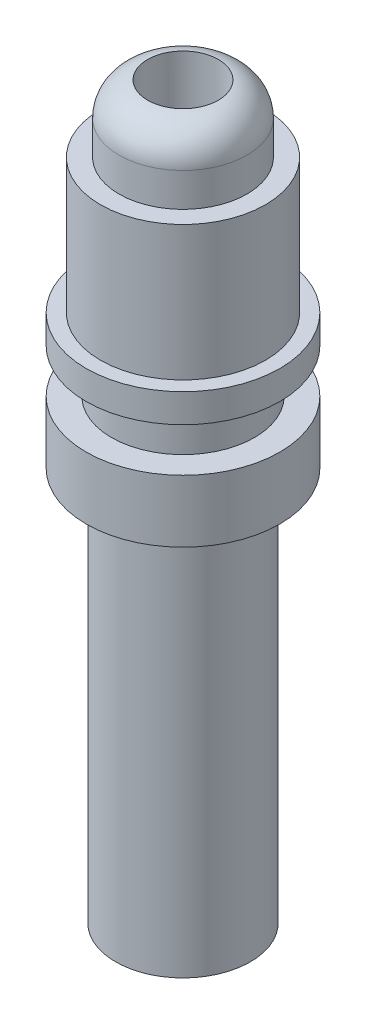
ISO-10303-21;
HEADER;
FILE_DESCRIPTION(('STEP AP214'),'2;1');
FILE_NAME('part.step','',(''),(''),'','','');
FILE_SCHEMA(('AUTOMOTIVE_DESIGN { 1 0 10303 214 1 1 1 1 }'));
ENDSEC;
DATA;
#1=APPLICATION_CONTEXT('core data for automotive mechanical design processes');
#2=APPLICATION_PROTOCOL_DEFINITION('international standard','automotive_design',2000,#1);
#3=PRODUCT_CONTEXT('',#1,'mechanical');
#4=PRODUCT('Part','Part','',(#3));
#5=PRODUCT_RELATED_PRODUCT_CATEGORY('part','',(#4));
#6=PRODUCT_DEFINITION_FORMATION('','',#4);
#7=PRODUCT_DEFINITION_CONTEXT('part definition',#1,'design');
#8=PRODUCT_DEFINITION('design','',#6,#7);
#9=PRODUCT_DEFINITION_SHAPE('','',#8);
#10=(LENGTH_UNIT() NAMED_UNIT(*) SI_UNIT(.MILLI.,.METRE.));
#11=(NAMED_UNIT(*) PLANE_ANGLE_UNIT() SI_UNIT($,.RADIAN.));
#12=(NAMED_UNIT(*) SI_UNIT($,.STERADIAN.) SOLID_ANGLE_UNIT());
#13=UNCERTAINTY_MEASURE_WITH_UNIT(LENGTH_MEASURE(1.E-05),#10,'distance_accuracy_value','');
#14=(GEOMETRIC_REPRESENTATION_CONTEXT(3) GLOBAL_UNCERTAINTY_ASSIGNED_CONTEXT((#13)) GLOBAL_UNIT_ASSIGNED_CONTEXT((#10,
#11,#12)) REPRESENTATION_CONTEXT('',''));
#15=CARTESIAN_POINT('',(0.,0.,0.));
#16=DIRECTION('',(0.,0.,1.));
#17=DIRECTION('',(1.,0.,0.));
#18=AXIS2_PLACEMENT_3D('',#15,#16,#17);
#19=CARTESIAN_POINT('',(0.,20.001,0.));
#20=DIRECTION('',(0.,-1.,0.));
#21=DIRECTION('',(0.,0.,-1.));
#22=AXIS2_PLACEMENT_3D('',#19,#20,#21);
#23=CYLINDRICAL_SURFACE('',#22,1.25);
#24=CARTESIAN_POINT('',(0.,-23.4,0.));
#25=DIRECTION('',(0.,-1.,0.));
#26=DIRECTION('',(0.,0.,-1.));
#27=AXIS2_PLACEMENT_3D('',#24,#25,#26);
#28=CIRCLE('',#27,1.25);
#29=CARTESIAN_POINT('',(0.,-23.4,-1.25));
#30=VERTEX_POINT('',#29);
#31=EDGE_CURVE('E70',#30,#30,#28,.T.);
#32=CARTESIAN_POINT('',(0.,8.,0.));
#33=DIRECTION('',(0.,1.,0.));
#34=DIRECTION('',(0.,0.,1.));
#35=AXIS2_PLACEMENT_3D('',#32,#33,#34);
#36=CIRCLE('',#35,1.25);
#37=CARTESIAN_POINT('',(0.,8.,-1.25));
#38=VERTEX_POINT('',#37);
#39=EDGE_CURVE('E64',#38,#38,#36,.F.);
#40=CARTESIAN_POINT('',(0.,-23.4,-1.25));
#41=CARTESIAN_POINT('',(0.,-23.0729166666667,-1.25));
#42=CARTESIAN_POINT('',(0.,-22.7458333333333,-1.25));
#43=CARTESIAN_POINT('',(0.,-22.0916666666667,-1.25));
#44=CARTESIAN_POINT('',(0.,-21.7645833333333,-1.25));
#45=CARTESIAN_POINT('',(0.,-21.1104166666667,-1.25));
#46=CARTESIAN_POINT('',(0.,-20.7833333333333,-1.25));
#47=CARTESIAN_POINT('',(0.,-20.1291666666667,-1.25));
#48=CARTESIAN_POINT('',(0.,-19.8020833333333,-1.25));
#49=CARTESIAN_POINT('',(0.,-19.1479166666667,-1.25));
#50=CARTESIAN_POINT('',(0.,-18.8208333333333,-1.25));
#51=CARTESIAN_POINT('',(0.,-18.1666666666667,-1.25));
#52=CARTESIAN_POINT('',(0.,-17.8395833333333,-1.25));
#53=CARTESIAN_POINT('',(0.,-17.1854166666667,-1.25));
#54=CARTESIAN_POINT('',(0.,-16.8583333333333,-1.25));
#55=CARTESIAN_POINT('',(0.,-16.2041666666667,-1.25));
#56=CARTESIAN_POINT('',(0.,-15.8770833333333,-1.25));
#57=CARTESIAN_POINT('',(0.,-15.2229166666667,-1.25));
#58=CARTESIAN_POINT('',(0.,-14.8958333333333,-1.25));
#59=CARTESIAN_POINT('',(0.,-14.2416666666667,-1.25));
#60=CARTESIAN_POINT('',(0.,-13.9145833333333,-1.25));
#61=CARTESIAN_POINT('',(0.,-13.2604166666667,-1.25));
#62=CARTESIAN_POINT('',(0.,-12.9333333333333,-1.25));
#63=CARTESIAN_POINT('',(0.,-12.2791666666667,-1.25));
#64=CARTESIAN_POINT('',(0.,-11.9520833333333,-1.25));
#65=CARTESIAN_POINT('',(0.,-11.2979166666667,-1.25));
#66=CARTESIAN_POINT('',(0.,-10.9708333333333,-1.25));
#67=CARTESIAN_POINT('',(0.,-10.3166666666667,-1.25));
#68=CARTESIAN_POINT('',(0.,-9.98958333333334,-1.25));
#69=CARTESIAN_POINT('',(0.,-9.33541666666667,-1.25));
#70=CARTESIAN_POINT('',(0.,-9.00833333333333,-1.25));
#71=CARTESIAN_POINT('',(0.,-8.35416666666667,-1.25));
#72=CARTESIAN_POINT('',(0.,-8.02708333333334,-1.25));
#73=CARTESIAN_POINT('',(0.,-7.37291666666667,-1.25));
#74=CARTESIAN_POINT('',(0.,-7.04583333333334,-1.25));
#75=CARTESIAN_POINT('',(0.,-6.39166666666667,-1.25));
#76=CARTESIAN_POINT('',(0.,-6.06458333333334,-1.25));
#77=CARTESIAN_POINT('',(0.,-5.41041666666667,-1.25));
#78=CARTESIAN_POINT('',(0.,-5.08333333333333,-1.25));
#79=CARTESIAN_POINT('',(0.,-4.42916666666667,-1.25));
#80=CARTESIAN_POINT('',(0.,-4.10208333333333,-1.25));
#81=CARTESIAN_POINT('',(0.,-3.44791666666667,-1.25));
#82=CARTESIAN_POINT('',(0.,-3.12083333333333,-1.25));
#83=CARTESIAN_POINT('',(0.,-2.46666666666667,-1.25));
#84=CARTESIAN_POINT('',(0.,-2.13958333333333,-1.25));
#85=CARTESIAN_POINT('',(0.,-1.48541666666667,-1.25));
#86=CARTESIAN_POINT('',(0.,-1.15833333333334,-1.25));
#87=CARTESIAN_POINT('',(0.,-0.504166666666669,-1.25));
#88=CARTESIAN_POINT('',(0.,-0.177083333333336,-1.25));
#89=CARTESIAN_POINT('',(0.,0.477083333333332,-1.25));
#90=CARTESIAN_POINT('',(0.,0.804166666666666,-1.25));
#91=CARTESIAN_POINT('',(0.,1.45833333333333,-1.25));
#92=CARTESIAN_POINT('',(0.,1.78541666666667,-1.25));
#93=CARTESIAN_POINT('',(0.,2.43958333333333,-1.25));
#94=CARTESIAN_POINT('',(0.,2.76666666666667,-1.25));
#95=CARTESIAN_POINT('',(0.,3.42083333333333,-1.25));
#96=CARTESIAN_POINT('',(0.,3.74791666666667,-1.25));
#97=CARTESIAN_POINT('',(0.,4.40208333333333,-1.25));
#98=CARTESIAN_POINT('',(0.,4.72916666666666,-1.25));
#99=CARTESIAN_POINT('',(0.,5.38333333333333,-1.25));
#100=CARTESIAN_POINT('',(0.,5.71041666666666,-1.25));
#101=CARTESIAN_POINT('',(0.,6.36458333333333,-1.25));
#102=CARTESIAN_POINT('',(0.,6.69166666666667,-1.25));
#103=CARTESIAN_POINT('',(0.,7.34583333333333,-1.25));
#104=CARTESIAN_POINT('',(0.,7.67291666666666,-1.25));
#105=CARTESIAN_POINT('',(0.,8.,-1.25));
#106=B_SPLINE_CURVE_WITH_KNOTS('',3,(#40,#41,#42,#43,#44,#45,#46,#47,#48,#49,#50,#51,#52,#53,
#54,#55,#56,#57,#58,#59,#60,#61,#62,#63,#64,#65,#66,#67,#68,#69,#70,#71,#72,#73,#74,#75,#76,#77,
#78,#79,#80,#81,#82,#83,#84,#85,#86,#87,#88,#89,#90,#91,#92,#93,#94,#95,#96,#97,#98,#99,#100,
#101,#102,#103,#104,#105),.UNSPECIFIED.,.F.,.F.,(4,2,2,2,2,2,2,2,2,2,2,2,2,2,2,2,2,2,2,2,2,2,2,
2,2,2,2,2,2,2,2,2,4),(0.,0.981250000000003,1.9625,2.94375,3.925,4.90625,5.8875,6.86875,7.85,
8.83125,9.8125,10.79375,11.775,12.75625,13.7375,14.71875,15.7,16.68125,17.6625,18.64375,19.625,
20.60625,21.5875,22.56875,23.55,24.53125,25.5125,26.49375,27.475,28.45625,29.4375,30.41875,
31.4),.UNSPECIFIED.);
#107=EDGE_CURVE('BSEAM32',#30,#38,#106,.T.);
#108=ORIENTED_EDGE('',*,*,#31,.T.);
#109=ORIENTED_EDGE('',*,*,#39,.F.);
#110=ORIENTED_EDGE('',*,*,#107,.T.);
#111=ORIENTED_EDGE('',*,*,#107,.F.);
#112=EDGE_LOOP('',(#108,#110,#109,#111));
#113=FACE_BOUND('',#112,.T.);
#114=ADVANCED_FACE('F32',(#113),#23,.F.);
#115=CARTESIAN_POINT('',(0.,16.,0.));
#116=DIRECTION('',(0.,-1.,0.));
#117=DIRECTION('',(0.,0.,-1.));
#118=AXIS2_PLACEMENT_3D('',#115,#116,#117);
#119=CYLINDRICAL_SURFACE('',#118,5.75);
#120=CARTESIAN_POINT('',(0.,6.3,0.));
#121=DIRECTION('',(0.,1.,0.));
#122=DIRECTION('',(0.,0.,1.));
#123=AXIS2_PLACEMENT_3D('',#120,#121,#122);
#124=CIRCLE('',#123,5.75);
#125=CARTESIAN_POINT('',(0.,6.3,5.75));
#126=VERTEX_POINT('',#125);
#127=EDGE_CURVE('E86',#126,#126,#124,.T.);
#128=ORIENTED_EDGE('',*,*,#127,.T.);
#129=EDGE_LOOP('',(#128));
#130=FACE_BOUND('',#129,.T.);
#131=CARTESIAN_POINT('',(0.,8.,0.));
#132=DIRECTION('',(0.,1.,0.));
#133=DIRECTION('',(0.,0.,1.));
#134=AXIS2_PLACEMENT_3D('',#131,#132,#133);
#135=CIRCLE('',#134,5.75);
#136=CARTESIAN_POINT('',(0.,8.,5.75));
#137=VERTEX_POINT('',#136);
#138=EDGE_CURVE('E57',#137,#137,#135,.T.);
#139=ORIENTED_EDGE('',*,*,#138,.F.);
#140=EDGE_LOOP('',(#139));
#141=FACE_BOUND('',#140,.T.);
#142=ADVANCED_FACE('F111',(#130,#141),#119,.T.);
#143=CARTESIAN_POINT('',(0.,8.,0.));
#144=DIRECTION('',(0.,1.,0.));
#145=DIRECTION('',(0.,0.,1.));
#146=AXIS2_PLACEMENT_3D('',#143,#144,#145);
#147=PLANE('',#146);
#148=CARTESIAN_POINT('',(0.,8.,0.));
#149=DIRECTION('',(0.,1.,0.));
#150=DIRECTION('',(0.,0.,1.));
#151=AXIS2_PLACEMENT_3D('',#148,#149,#150);
#152=CIRCLE('',#151,4.9);
#153=CARTESIAN_POINT('',(0.,8.,4.9));
#154=VERTEX_POINT('',#153);
#155=EDGE_CURVE('E54',#154,#154,#152,.T.);
#156=ORIENTED_EDGE('',*,*,#155,.F.);
#157=EDGE_LOOP('',(#156));
#158=FACE_BOUND('',#157,.T.);
#159=ORIENTED_EDGE('',*,*,#138,.T.);
#160=EDGE_LOOP('',(#159));
#161=FACE_BOUND('',#160,.T.);
#162=ADVANCED_FACE('F117',(#158,#161),#147,.T.);
#163=CARTESIAN_POINT('',(0.,8.,0.));
#164=DIRECTION('',(0.,1.,0.));
#165=DIRECTION('',(0.,0.,1.));
#166=AXIS2_PLACEMENT_3D('',#163,#164,#165);
#167=CYLINDRICAL_SURFACE('',#166,4.9);
#168=ORIENTED_EDGE('',*,*,#155,.T.);
#169=EDGE_LOOP('',(#168));
#170=FACE_BOUND('',#169,.T.);
#171=CARTESIAN_POINT('',(0.,16.,0.));
#172=DIRECTION('',(0.,1.,0.));
#173=DIRECTION('',(0.,0.,1.));
#174=AXIS2_PLACEMENT_3D('',#171,#172,#173);
#175=CIRCLE('',#174,4.9);
#176=CARTESIAN_POINT('',(0.,16.,4.9));
#177=VERTEX_POINT('',#176);
#178=EDGE_CURVE('E58',#177,#177,#175,.T.);
#179=ORIENTED_EDGE('',*,*,#178,.F.);
#180=EDGE_LOOP('',(#179));
#181=FACE_BOUND('',#180,.T.);
#182=ADVANCED_FACE('F157',(#170,#181),#167,.T.);
#183=CARTESIAN_POINT('',(0.,16.,0.));
#184=DIRECTION('',(0.,1.,0.));
#185=DIRECTION('',(0.,0.,1.));
#186=AXIS2_PLACEMENT_3D('',#183,#184,#185);
#187=PLANE('',#186);
#188=CARTESIAN_POINT('',(0.,16.,0.));
#189=DIRECTION('',(0.,1.,0.));
#190=DIRECTION('',(0.,0.,1.));
#191=AXIS2_PLACEMENT_3D('',#188,#189,#190);
#192=CIRCLE('',#191,3.8);
#193=CARTESIAN_POINT('',(0.,16.,3.8));
#194=VERTEX_POINT('',#193);
#195=EDGE_CURVE('E45',#194,#194,#192,.T.);
#196=ORIENTED_EDGE('',*,*,#195,.F.);
#197=EDGE_LOOP('',(#196));
#198=FACE_BOUND('',#197,.T.);
#199=ORIENTED_EDGE('',*,*,#178,.T.);
#200=EDGE_LOOP('',(#199));
#201=FACE_BOUND('',#200,.T.);
#202=ADVANCED_FACE('F154',(#198,#201),#187,.T.);
#203=CARTESIAN_POINT('',(0.,20.,0.));
#204=DIRECTION('',(0.,-1.,0.));
#205=DIRECTION('',(0.,0.,-1.));
#206=AXIS2_PLACEMENT_3D('',#203,#204,#205);
#207=CYLINDRICAL_SURFACE('',#206,3.8);
#208=CARTESIAN_POINT('',(0.,18.,0.));
#209=DIRECTION('',(0.,1.,0.));
#210=DIRECTION('',(0.,0.,1.));
#211=AXIS2_PLACEMENT_3D('',#208,#209,#210);
#212=CIRCLE('',#211,3.8);
#213=CARTESIAN_POINT('',(0.,18.,3.8));
#214=VERTEX_POINT('',#213);
#215=EDGE_CURVE('E40',#214,#214,#212,.F.);
#216=ORIENTED_EDGE('',*,*,#215,.T.);
#217=EDGE_LOOP('',(#216));
#218=FACE_BOUND('',#217,.T.);
#219=ORIENTED_EDGE('',*,*,#195,.T.);
#220=EDGE_LOOP('',(#219));
#221=FACE_BOUND('',#220,.T.);
#222=ADVANCED_FACE('F136',(#218,#221),#207,.T.);
#223=CARTESIAN_POINT('',(0.,18.,0.));
#224=DIRECTION('',(0.,1.,0.));
#225=DIRECTION('',(0.,0.,1.));
#226=AXIS2_PLACEMENT_3D('',#223,#224,#225);
#227=DEGENERATE_TOROIDAL_SURFACE('',#226,1.8,2.,.T.);
#228=CARTESIAN_POINT('',(0.,19.9773719933285,0.));
#229=DIRECTION('',(0.,-1.,0.));
#230=DIRECTION('',(0.,0.,-1.));
#231=AXIS2_PLACEMENT_3D('',#228,#229,#230);
#232=CIRCLE('',#231,2.1);
#233=CARTESIAN_POINT('',(0.,19.9773719933285,-2.1));
#234=VERTEX_POINT('',#233);
#235=EDGE_CURVE('E36',#234,#234,#232,.F.);
#236=ORIENTED_EDGE('',*,*,#235,.F.);
#237=EDGE_LOOP('',(#236));
#238=FACE_BOUND('',#237,.T.);
#239=ORIENTED_EDGE('',*,*,#215,.F.);
#240=EDGE_LOOP('',(#239));
#241=FACE_BOUND('',#240,.T.);
#242=ADVANCED_FACE('F34',(#238,#241),#227,.T.);
#243=CARTESIAN_POINT('',(0.,6.3,5.75));
#244=DIRECTION('',(0.,1.,0.));
#245=DIRECTION('',(0.,0.,1.));
#246=AXIS2_PLACEMENT_3D('',#243,#244,#245);
#247=PLANE('',#246);
#248=ORIENTED_EDGE('',*,*,#127,.F.);
#249=EDGE_LOOP('',(#248));
#250=FACE_BOUND('',#249,.T.);
#251=CARTESIAN_POINT('',(0.,6.3,0.));
#252=DIRECTION('',(0.,1.,0.));
#253=DIRECTION('',(0.,0.,1.));
#254=AXIS2_PLACEMENT_3D('',#251,#252,#253);
#255=CIRCLE('',#254,4.25);
#256=CARTESIAN_POINT('',(0.,6.3,4.25));
#257=VERTEX_POINT('',#256);
#258=EDGE_CURVE('E84',#257,#257,#255,.T.);
#259=ORIENTED_EDGE('',*,*,#258,.T.);
#260=EDGE_LOOP('',(#259));
#261=FACE_BOUND('',#260,.T.);
#262=ADVANCED_FACE('F129',(#250,#261),#247,.F.);
#263=CARTESIAN_POINT('',(0.,8.,0.));
#264=DIRECTION('',(0.,1.,0.));
#265=DIRECTION('',(0.,0.,1.));
#266=AXIS2_PLACEMENT_3D('',#263,#264,#265);
#267=CYLINDRICAL_SURFACE('',#266,4.25);
#268=ORIENTED_EDGE('',*,*,#258,.F.);
#269=EDGE_LOOP('',(#268));
#270=FACE_BOUND('',#269,.T.);
#271=CARTESIAN_POINT('',(0.,3.7,0.));
#272=DIRECTION('',(0.,1.,0.));
#273=DIRECTION('',(0.,0.,1.));
#274=AXIS2_PLACEMENT_3D('',#271,#272,#273);
#275=CIRCLE('',#274,4.25);
#276=CARTESIAN_POINT('',(0.,3.7,4.25));
#277=VERTEX_POINT('',#276);
#278=EDGE_CURVE('E81',#277,#277,#275,.T.);
#279=ORIENTED_EDGE('',*,*,#278,.T.);
#280=EDGE_LOOP('',(#279));
#281=FACE_BOUND('',#280,.T.);
#282=ADVANCED_FACE('F125',(#270,#281),#267,.T.);
#283=CARTESIAN_POINT('',(0.,3.7,4.25));
#284=DIRECTION('',(0.,-1.,0.));
#285=DIRECTION('',(0.,0.,-1.));
#286=AXIS2_PLACEMENT_3D('',#283,#284,#285);
#287=PLANE('',#286);
#288=ORIENTED_EDGE('',*,*,#278,.F.);
#289=EDGE_LOOP('',(#288));
#290=FACE_BOUND('',#289,.T.);
#291=CARTESIAN_POINT('',(0.,3.7,0.));
#292=DIRECTION('',(0.,1.,0.));
#293=DIRECTION('',(0.,0.,1.));
#294=AXIS2_PLACEMENT_3D('',#291,#292,#293);
#295=CIRCLE('',#294,5.75);
#296=CARTESIAN_POINT('',(0.,3.7,5.75));
#297=VERTEX_POINT('',#296);
#298=EDGE_CURVE('E78',#297,#297,#295,.T.);
#299=ORIENTED_EDGE('',*,*,#298,.T.);
#300=EDGE_LOOP('',(#299));
#301=FACE_BOUND('',#300,.T.);
#302=ADVANCED_FACE('F106',(#290,#301),#287,.F.);
#303=CARTESIAN_POINT('',(0.,-23.4,0.));
#304=DIRECTION('',(0.,-1.,0.));
#305=DIRECTION('',(0.,0.,-1.));
#306=AXIS2_PLACEMENT_3D('',#303,#304,#305);
#307=PLANE('',#306);
#308=ORIENTED_EDGE('',*,*,#31,.F.);
#309=EDGE_LOOP('',(#308));
#310=FACE_BOUND('',#309,.T.);
#311=CARTESIAN_POINT('',(0.,-23.4,0.));
#312=DIRECTION('',(0.,-1.,0.));
#313=DIRECTION('',(0.,0.,-1.));
#314=AXIS2_PLACEMENT_3D('',#311,#312,#313);
#315=CIRCLE('',#314,4.);
#316=CARTESIAN_POINT('',(0.,-23.4,-4.));
#317=VERTEX_POINT('',#316);
#318=EDGE_CURVE('E49',#317,#317,#315,.T.);
#319=ORIENTED_EDGE('',*,*,#318,.T.);
#320=EDGE_LOOP('',(#319));
#321=FACE_BOUND('',#320,.T.);
#322=ADVANCED_FACE('F93',(#310,#321),#307,.T.);
#323=CARTESIAN_POINT('',(0.,-23.4,0.));
#324=DIRECTION('',(0.,1.,0.));
#325=DIRECTION('',(0.,0.,1.));
#326=AXIS2_PLACEMENT_3D('',#323,#324,#325);
#327=CYLINDRICAL_SURFACE('',#326,4.);
#328=ORIENTED_EDGE('',*,*,#318,.F.);
#329=EDGE_LOOP('',(#328));
#330=FACE_BOUND('',#329,.T.);
#331=CARTESIAN_POINT('',(0.,0.,0.));
#332=DIRECTION('',(0.,-1.,0.));
#333=DIRECTION('',(0.,0.,-1.));
#334=AXIS2_PLACEMENT_3D('',#331,#332,#333);
#335=CIRCLE('',#334,4.);
#336=CARTESIAN_POINT('',(0.,0.,-4.));
#337=VERTEX_POINT('',#336);
#338=EDGE_CURVE('E11',#337,#337,#335,.T.);
#339=ORIENTED_EDGE('',*,*,#338,.T.);
#340=EDGE_LOOP('',(#339));
#341=FACE_BOUND('',#340,.T.);
#342=ADVANCED_FACE('F95',(#330,#341),#327,.T.);
#343=CARTESIAN_POINT('',(0.,0.,0.));
#344=DIRECTION('',(0.,1.,0.));
#345=DIRECTION('',(0.,0.,1.));
#346=AXIS2_PLACEMENT_3D('',#343,#344,#345);
#347=PLANE('',#346);
#348=ORIENTED_EDGE('',*,*,#338,.F.);
#349=EDGE_LOOP('',(#348));
#350=FACE_BOUND('',#349,.T.);
#351=CARTESIAN_POINT('',(0.,0.,0.));
#352=DIRECTION('',(0.,1.,0.));
#353=DIRECTION('',(0.,0.,1.));
#354=AXIS2_PLACEMENT_3D('',#351,#352,#353);
#355=CIRCLE('',#354,5.75);
#356=CARTESIAN_POINT('',(0.,0.,5.75));
#357=VERTEX_POINT('',#356);
#358=EDGE_CURVE('E53',#357,#357,#355,.T.);
#359=ORIENTED_EDGE('',*,*,#358,.F.);
#360=EDGE_LOOP('',(#359));
#361=FACE_BOUND('',#360,.T.);
#362=ADVANCED_FACE('F97',(#350,#361),#347,.F.);
#363=ORIENTED_EDGE('',*,*,#298,.F.);
#364=EDGE_LOOP('',(#363));
#365=FACE_BOUND('',#364,.T.);
#366=ORIENTED_EDGE('',*,*,#358,.T.);
#367=EDGE_LOOP('',(#366));
#368=FACE_BOUND('',#367,.T.);
#369=ADVANCED_FACE('F103',(#365,#368),#119,.T.);
#370=CARTESIAN_POINT('',(0.,8.,0.));
#371=DIRECTION('',(0.,1.,0.));
#372=DIRECTION('',(0.,0.,1.));
#373=AXIS2_PLACEMENT_3D('',#370,#371,#372);
#374=PLANE('',#373);
#375=CARTESIAN_POINT('',(0.,8.,0.));
#376=DIRECTION('',(0.,1.,0.));
#377=DIRECTION('',(0.,0.,1.));
#378=AXIS2_PLACEMENT_3D('',#375,#376,#377);
#379=CIRCLE('',#378,2.1);
#380=CARTESIAN_POINT('',(0.,8.,2.1));
#381=VERTEX_POINT('',#380);
#382=EDGE_CURVE('E66',#381,#381,#379,.T.);
#383=ORIENTED_EDGE('',*,*,#382,.T.);
#384=EDGE_LOOP('',(#383));
#385=FACE_BOUND('',#384,.T.);
#386=ORIENTED_EDGE('',*,*,#39,.T.);
#387=EDGE_LOOP('',(#386));
#388=FACE_BOUND('',#387,.T.);
#389=ADVANCED_FACE('F147',(#385,#388),#374,.T.);
#390=CARTESIAN_POINT('',(0.,8.,0.));
#391=DIRECTION('',(0.,1.,0.));
#392=DIRECTION('',(0.,0.,1.));
#393=AXIS2_PLACEMENT_3D('',#390,#391,#392);
#394=CYLINDRICAL_SURFACE('',#393,2.1);
#395=ORIENTED_EDGE('',*,*,#235,.T.);
#396=EDGE_LOOP('',(#395));
#397=FACE_BOUND('',#396,.T.);
#398=ORIENTED_EDGE('',*,*,#382,.F.);
#399=EDGE_LOOP('',(#398));
#400=FACE_BOUND('',#399,.T.);
#401=ADVANCED_FACE('F121',(#397,#400),#394,.F.);
#402=CLOSED_SHELL('',(#114,#142,#162,#182,#202,#222,#242,#262,#282,#302,#322,#342,#362,#369,
#389,#401));
#403=MANIFOLD_SOLID_BREP('B2',#402);
#404=ADVANCED_BREP_SHAPE_REPRESENTATION('',(#18,#403),#14);
#405=SHAPE_DEFINITION_REPRESENTATION(#9,#404);
ENDSEC;
END-ISO-10303-21;
